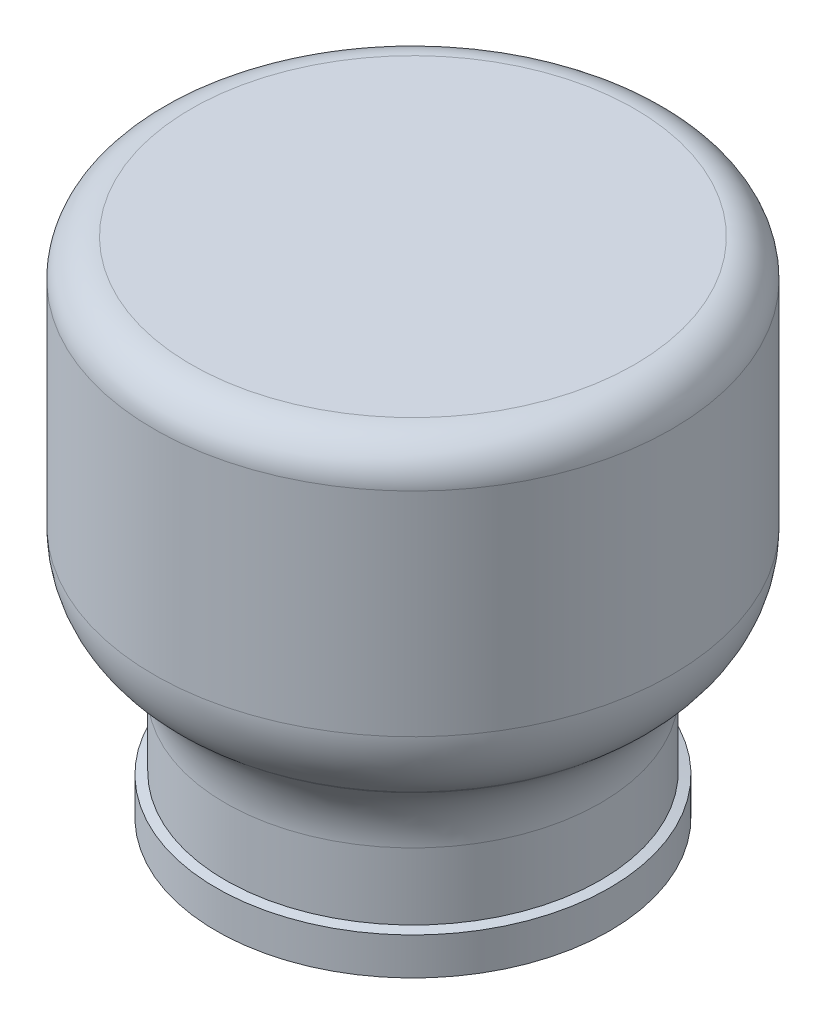
ISO-10303-21;
HEADER;
FILE_DESCRIPTION(('STEP AP214'),'2;1');
FILE_NAME('part.step','',(''),(''),'','','');
FILE_SCHEMA(('AUTOMOTIVE_DESIGN { 1 0 10303 214 1 1 1 1 }'));
ENDSEC;
DATA;
#1=APPLICATION_CONTEXT('core data for automotive mechanical design processes');
#2=APPLICATION_PROTOCOL_DEFINITION('international standard','automotive_design',2000,#1);
#3=PRODUCT_CONTEXT('',#1,'mechanical');
#4=PRODUCT('Part','Part','',(#3));
#5=PRODUCT_RELATED_PRODUCT_CATEGORY('part','',(#4));
#6=PRODUCT_DEFINITION_FORMATION('','',#4);
#7=PRODUCT_DEFINITION_CONTEXT('part definition',#1,'design');
#8=PRODUCT_DEFINITION('design','',#6,#7);
#9=PRODUCT_DEFINITION_SHAPE('','',#8);
#10=(LENGTH_UNIT() NAMED_UNIT(*) SI_UNIT(.MILLI.,.METRE.));
#11=(NAMED_UNIT(*) PLANE_ANGLE_UNIT() SI_UNIT($,.RADIAN.));
#12=(NAMED_UNIT(*) SI_UNIT($,.STERADIAN.) SOLID_ANGLE_UNIT());
#13=UNCERTAINTY_MEASURE_WITH_UNIT(LENGTH_MEASURE(1.E-05),#10,'distance_accuracy_value','');
#14=(GEOMETRIC_REPRESENTATION_CONTEXT(3) GLOBAL_UNCERTAINTY_ASSIGNED_CONTEXT((#13)) GLOBAL_UNIT_ASSIGNED_CONTEXT((#10,
#11,#12)) REPRESENTATION_CONTEXT('',''));
#15=CARTESIAN_POINT('',(0.,0.,0.));
#16=DIRECTION('',(0.,0.,1.));
#17=DIRECTION('',(1.,0.,0.));
#18=AXIS2_PLACEMENT_3D('',#15,#16,#17);
#19=CARTESIAN_POINT('',(1.14462986457853,39.,16.9000000000001));
#20=DIRECTION('',(0.,0.,1.));
#21=DIRECTION('',(1.,0.,0.));
#22=AXIS2_PLACEMENT_3D('',#19,#20,#21);
#23=CYLINDRICAL_SURFACE('',#22,10.);
#24=CARTESIAN_POINT('',(1.14462986457853,39.,16.9000000000001));
#25=DIRECTION('',(0.,0.,1.));
#26=DIRECTION('',(1.,0.,0.));
#27=AXIS2_PLACEMENT_3D('',#24,#25,#26);
#28=CIRCLE('',#27,10.);
#29=CARTESIAN_POINT('',(11.1446298645785,39.,16.9000000000001));
#30=VERTEX_POINT('',#29);
#31=EDGE_CURVE('E11',#30,#30,#28,.T.);
#32=ORIENTED_EDGE('',*,*,#31,.T.);
#33=EDGE_LOOP('',(#32));
#34=FACE_BOUND('',#33,.T.);
#35=CARTESIAN_POINT('',(1.14462986457853,39.,22.9000000000001));
#36=DIRECTION('',(0.,0.,1.));
#37=DIRECTION('',(1.,0.,0.));
#38=AXIS2_PLACEMENT_3D('',#35,#36,#37);
#39=CIRCLE('',#38,10.);
#40=CARTESIAN_POINT('',(11.1446298645785,39.,22.9000000000001));
#41=VERTEX_POINT('',#40);
#42=EDGE_CURVE('E46',#41,#41,#39,.T.);
#43=ORIENTED_EDGE('',*,*,#42,.F.);
#44=EDGE_LOOP('',(#43));
#45=FACE_BOUND('',#44,.T.);
#46=ADVANCED_FACE('F43',(#34,#45),#23,.T.);
#47=CARTESIAN_POINT('',(1.14462986457853,39.,16.9000000000001));
#48=DIRECTION('',(0.,0.,1.));
#49=DIRECTION('',(1.,0.,0.));
#50=AXIS2_PLACEMENT_3D('',#47,#48,#49);
#51=PLANE('',#50);
#52=ORIENTED_EDGE('',*,*,#31,.F.);
#53=EDGE_LOOP('',(#52));
#54=FACE_BOUND('',#53,.T.);
#55=ADVANCED_FACE('F58',(#54),#51,.F.);
#56=CARTESIAN_POINT('',(1.14462986457853,39.,22.9000000000001));
#57=DIRECTION('',(0.,0.,1.));
#58=DIRECTION('',(1.,0.,0.));
#59=AXIS2_PLACEMENT_3D('',#56,#57,#58);
#60=PLANE('',#59);
#61=ORIENTED_EDGE('',*,*,#42,.T.);
#62=EDGE_LOOP('',(#61));
#63=FACE_BOUND('',#62,.T.);
#64=ADVANCED_FACE('F55',(#63),#60,.T.);
#65=CLOSED_SHELL('',(#46,#55,#64));
#66=MANIFOLD_SOLID_BREP('B2',#65);
#67=CARTESIAN_POINT('',(19.9,15.,0.));
#68=DIRECTION('',(0.,-1.,0.));
#69=DIRECTION('',(1.,0.,0.));
#70=AXIS2_PLACEMENT_3D('',#67,#68,#69);
#71=PLANE('',#70);
#72=CARTESIAN_POINT('',(2.76491495539483,15.,0.));
#73=DIRECTION('',(0.,-1.,0.));
#74=DIRECTION('',(1.,0.,0.));
#75=AXIS2_PLACEMENT_3D('',#72,#73,#74);
#76=CIRCLE('',#75,17.1350850446052);
#77=CARTESIAN_POINT('',(19.9,15.,0.));
#78=VERTEX_POINT('',#77);
#79=EDGE_CURVE('E111',#78,#78,#76,.T.);
#80=ORIENTED_EDGE('',*,*,#79,.T.);
#81=EDGE_LOOP('',(#80));
#82=FACE_BOUND('',#81,.T.);
#83=ADVANCED_FACE('F87',(#82),#71,.T.);
#84=CARTESIAN_POINT('',(2.76491495539483,14.,0.));
#85=DIRECTION('',(0.,-1.,0.));
#86=DIRECTION('',(1.,0.,0.));
#87=AXIS2_PLACEMENT_3D('',#84,#85,#86);
#88=TOROIDAL_SURFACE('',#87,17.1350850446052,1.);
#89=CARTESIAN_POINT('',(2.76491495539483,14.,0.));
#90=DIRECTION('',(0.,-1.,0.));
#91=DIRECTION('',(1.,0.,0.));
#92=AXIS2_PLACEMENT_3D('',#89,#90,#91);
#93=CIRCLE('',#92,18.1350850446052);
#94=CARTESIAN_POINT('',(20.9,14.,0.));
#95=VERTEX_POINT('',#94);
#96=EDGE_CURVE('E114',#95,#95,#93,.T.);
#97=ORIENTED_EDGE('',*,*,#96,.T.);
#98=EDGE_LOOP('',(#97));
#99=FACE_BOUND('',#98,.T.);
#100=ORIENTED_EDGE('',*,*,#79,.F.);
#101=EDGE_LOOP('',(#100));
#102=FACE_BOUND('',#101,.T.);
#103=ADVANCED_FACE('F182',(#99,#102),#88,.F.);
#104=CARTESIAN_POINT('',(2.76491495539483,7.82182165652493,0.));
#105=DIRECTION('',(0.,-1.,0.));
#106=DIRECTION('',(1.,0.,0.));
#107=AXIS2_PLACEMENT_3D('',#104,#105,#106);
#108=CYLINDRICAL_SURFACE('',#107,18.1350850446052);
#109=CARTESIAN_POINT('',(2.76491495539483,0.,0.));
#110=DIRECTION('',(0.,-1.,0.));
#111=DIRECTION('',(1.,0.,0.));
#112=AXIS2_PLACEMENT_3D('',#109,#110,#111);
#113=CIRCLE('',#112,18.1350850446052);
#114=CARTESIAN_POINT('',(20.9,0.,0.));
#115=VERTEX_POINT('',#114);
#116=EDGE_CURVE('E117',#115,#115,#113,.T.);
#117=ORIENTED_EDGE('',*,*,#116,.T.);
#118=EDGE_LOOP('',(#117));
#119=FACE_BOUND('',#118,.T.);
#120=ORIENTED_EDGE('',*,*,#96,.F.);
#121=EDGE_LOOP('',(#120));
#122=FACE_BOUND('',#121,.T.);
#123=ADVANCED_FACE('F186',(#119,#122),#108,.F.);
#124=CARTESIAN_POINT('',(20.9,0.,0.));
#125=DIRECTION('',(0.,-1.,0.));
#126=DIRECTION('',(1.,0.,0.));
#127=AXIS2_PLACEMENT_3D('',#124,#125,#126);
#128=PLANE('',#127);
#129=CARTESIAN_POINT('',(2.76491495539483,0.,0.));
#130=DIRECTION('',(0.,-1.,0.));
#131=DIRECTION('',(1.,0.,0.));
#132=AXIS2_PLACEMENT_3D('',#129,#130,#131);
#133=CIRCLE('',#132,21.1066768821093);
#134=CARTESIAN_POINT('',(23.8715918375041,0.,0.));
#135=VERTEX_POINT('',#134);
#136=EDGE_CURVE('E120',#135,#135,#133,.T.);
#137=ORIENTED_EDGE('',*,*,#136,.T.);
#138=EDGE_LOOP('',(#137));
#139=FACE_BOUND('',#138,.T.);
#140=ORIENTED_EDGE('',*,*,#116,.F.);
#141=EDGE_LOOP('',(#140));
#142=FACE_BOUND('',#141,.T.);
#143=ADVANCED_FACE('F190',(#139,#142),#128,.T.);
#144=CARTESIAN_POINT('',(2.76491495539483,7.82182165652493,0.));
#145=DIRECTION('',(0.,-1.,0.));
#146=DIRECTION('',(1.,0.,0.));
#147=AXIS2_PLACEMENT_3D('',#144,#145,#146);
#148=CYLINDRICAL_SURFACE('',#147,21.1066768821093);
#149=CARTESIAN_POINT('',(2.76491495539483,4.,0.));
#150=DIRECTION('',(0.,-1.,0.));
#151=DIRECTION('',(1.,0.,0.));
#152=AXIS2_PLACEMENT_3D('',#149,#150,#151);
#153=CIRCLE('',#152,21.1066768821093);
#154=CARTESIAN_POINT('',(23.8715918375041,4.,0.));
#155=VERTEX_POINT('',#154);
#156=EDGE_CURVE('E123',#155,#155,#153,.T.);
#157=ORIENTED_EDGE('',*,*,#156,.T.);
#158=EDGE_LOOP('',(#157));
#159=FACE_BOUND('',#158,.T.);
#160=ORIENTED_EDGE('',*,*,#136,.F.);
#161=EDGE_LOOP('',(#160));
#162=FACE_BOUND('',#161,.T.);
#163=ADVANCED_FACE('F194',(#159,#162),#148,.T.);
#164=CARTESIAN_POINT('',(2.76491495539483,4.,0.));
#165=DIRECTION('',(0.,-1.,0.));
#166=DIRECTION('',(1.,0.,0.));
#167=AXIS2_PLACEMENT_3D('',#164,#165,#166);
#168=CONICAL_SURFACE('',#167,21.1066768821093,1.33186665186768);
#169=CARTESIAN_POINT('',(2.76491495539483,4.23666284308145,0.));
#170=DIRECTION('',(0.,-1.,0.));
#171=DIRECTION('',(1.,0.,0.));
#172=AXIS2_PLACEMENT_3D('',#169,#170,#171);
#173=CIRCLE('',#172,20.1350850446052);
#174=CARTESIAN_POINT('',(22.9,4.23666284308145,0.));
#175=VERTEX_POINT('',#174);
#176=EDGE_CURVE('E126',#175,#175,#173,.T.);
#177=ORIENTED_EDGE('',*,*,#176,.T.);
#178=EDGE_LOOP('',(#177));
#179=FACE_BOUND('',#178,.T.);
#180=ORIENTED_EDGE('',*,*,#156,.F.);
#181=EDGE_LOOP('',(#180));
#182=FACE_BOUND('',#181,.T.);
#183=ADVANCED_FACE('F198',(#179,#182),#168,.T.);
#184=CARTESIAN_POINT('',(2.76491495539483,7.82182165652493,0.));
#185=DIRECTION('',(0.,-1.,0.));
#186=DIRECTION('',(1.,0.,0.));
#187=AXIS2_PLACEMENT_3D('',#184,#185,#186);
#188=CYLINDRICAL_SURFACE('',#187,20.1350850446052);
#189=CARTESIAN_POINT('',(2.76491495539483,11.4043081021399,0.));
#190=DIRECTION('',(0.,-1.,0.));
#191=DIRECTION('',(1.,0.,0.));
#192=AXIS2_PLACEMENT_3D('',#189,#190,#191);
#193=CIRCLE('',#192,20.1350850446052);
#194=CARTESIAN_POINT('',(22.9,11.4043081021399,0.));
#195=VERTEX_POINT('',#194);
#196=EDGE_CURVE('E129',#195,#195,#193,.T.);
#197=ORIENTED_EDGE('',*,*,#196,.T.);
#198=EDGE_LOOP('',(#197));
#199=FACE_BOUND('',#198,.T.);
#200=ORIENTED_EDGE('',*,*,#176,.F.);
#201=EDGE_LOOP('',(#200));
#202=FACE_BOUND('',#201,.T.);
#203=ADVANCED_FACE('F202',(#199,#202),#188,.T.);
#204=CARTESIAN_POINT('',(2.76491495539483,11.40430810214,0.));
#205=DIRECTION('',(0.,-1.,0.));
#206=DIRECTION('',(1.,0.,0.));
#207=AXIS2_PLACEMENT_3D('',#204,#205,#206);
#208=TOROIDAL_SURFACE('',#207,30.1350850446052,10.);
#209=CARTESIAN_POINT('',(2.76491495539483,19.0647525333298,0.));
#210=DIRECTION('',(0.,-1.,0.));
#211=DIRECTION('',(1.,0.,0.));
#212=AXIS2_PLACEMENT_3D('',#209,#210,#211);
#213=CIRCLE('',#212,23.7072089477399);
#214=CARTESIAN_POINT('',(26.4721239031347,19.0647525333298,0.));
#215=VERTEX_POINT('',#214);
#216=EDGE_CURVE('E132',#215,#215,#213,.T.);
#217=ORIENTED_EDGE('',*,*,#216,.T.);
#218=EDGE_LOOP('',(#217));
#219=FACE_BOUND('',#218,.T.);
#220=ORIENTED_EDGE('',*,*,#196,.F.);
#221=EDGE_LOOP('',(#220));
#222=FACE_BOUND('',#221,.T.);
#223=ADVANCED_FACE('F206',(#219,#222),#208,.F.);
#224=CARTESIAN_POINT('',(2.76491495539483,19.0647525333298,0.));
#225=DIRECTION('',(0.,1.,0.));
#226=DIRECTION('',(-1.,0.,0.));
#227=AXIS2_PLACEMENT_3D('',#224,#225,#226);
#228=CONICAL_SURFACE('',#227,23.7072089477399,0.872664625997171);
#229=CARTESIAN_POINT('',(2.76491495539483,19.4978929309155,0.));
#230=DIRECTION('',(0.,-1.,0.));
#231=DIRECTION('',(1.,0.,0.));
#232=AXIS2_PLACEMENT_3D('',#229,#230,#231);
#233=CIRCLE('',#232,24.2234055726603);
#234=CARTESIAN_POINT('',(26.9883205280551,19.4978929309155,0.));
#235=VERTEX_POINT('',#234);
#236=EDGE_CURVE('E135',#235,#235,#233,.T.);
#237=ORIENTED_EDGE('',*,*,#236,.T.);
#238=EDGE_LOOP('',(#237));
#239=FACE_BOUND('',#238,.T.);
#240=ORIENTED_EDGE('',*,*,#216,.F.);
#241=EDGE_LOOP('',(#240));
#242=FACE_BOUND('',#241,.T.);
#243=ADVANCED_FACE('F210',(#239,#242),#228,.T.);
#244=CARTESIAN_POINT('',(2.76491495539483,27.1583373621054,0.));
#245=DIRECTION('',(0.,-1.,0.));
#246=DIRECTION('',(1.,0.,0.));
#247=AXIS2_PLACEMENT_3D('',#244,#245,#246);
#248=TOROIDAL_SURFACE('',#247,17.795529475795,10.);
#249=CARTESIAN_POINT('',(2.76491495539483,27.1583373621054,0.));
#250=DIRECTION('',(0.,-1.,0.));
#251=DIRECTION('',(1.,0.,0.));
#252=AXIS2_PLACEMENT_3D('',#249,#250,#251);
#253=CIRCLE('',#252,27.795529475795);
#254=CARTESIAN_POINT('',(30.5604444311898,27.1583373621054,0.));
#255=VERTEX_POINT('',#254);
#256=EDGE_CURVE('E138',#255,#255,#253,.T.);
#257=ORIENTED_EDGE('',*,*,#256,.T.);
#258=EDGE_LOOP('',(#257));
#259=FACE_BOUND('',#258,.T.);
#260=ORIENTED_EDGE('',*,*,#236,.F.);
#261=EDGE_LOOP('',(#260));
#262=FACE_BOUND('',#261,.T.);
#263=ADVANCED_FACE('F214',(#259,#262),#248,.T.);
#264=CARTESIAN_POINT('',(2.76491495539483,7.82182165652493,0.));
#265=DIRECTION('',(0.,-1.,0.));
#266=DIRECTION('',(1.,0.,0.));
#267=AXIS2_PLACEMENT_3D('',#264,#265,#266);
#268=CYLINDRICAL_SURFACE('',#267,27.795529475795);
#269=CARTESIAN_POINT('',(2.76491495539482,50.,0.));
#270=DIRECTION('',(0.,-1.,0.));
#271=DIRECTION('',(1.,0.,0.));
#272=AXIS2_PLACEMENT_3D('',#269,#270,#271);
#273=CIRCLE('',#272,27.795529475795);
#274=CARTESIAN_POINT('',(30.5604444311898,50.,0.));
#275=VERTEX_POINT('',#274);
#276=EDGE_CURVE('E141',#275,#275,#273,.T.);
#277=ORIENTED_EDGE('',*,*,#276,.T.);
#278=EDGE_LOOP('',(#277));
#279=FACE_BOUND('',#278,.T.);
#280=ORIENTED_EDGE('',*,*,#256,.F.);
#281=EDGE_LOOP('',(#280));
#282=FACE_BOUND('',#281,.T.);
#283=ADVANCED_FACE('F218',(#279,#282),#268,.T.);
#284=CARTESIAN_POINT('',(2.76491495539482,50.,0.));
#285=DIRECTION('',(0.,-1.,0.));
#286=DIRECTION('',(1.,0.,0.));
#287=AXIS2_PLACEMENT_3D('',#284,#285,#286);
#288=TOROIDAL_SURFACE('',#287,23.795529475795,4.);
#289=CARTESIAN_POINT('',(2.76491495539482,54.,0.));
#290=DIRECTION('',(0.,-1.,0.));
#291=DIRECTION('',(1.,0.,0.));
#292=AXIS2_PLACEMENT_3D('',#289,#290,#291);
#293=CIRCLE('',#292,23.795529475795);
#294=CARTESIAN_POINT('',(26.5604444311898,54.,0.));
#295=VERTEX_POINT('',#294);
#296=EDGE_CURVE('E144',#295,#295,#293,.T.);
#297=ORIENTED_EDGE('',*,*,#296,.T.);
#298=EDGE_LOOP('',(#297));
#299=FACE_BOUND('',#298,.T.);
#300=ORIENTED_EDGE('',*,*,#276,.F.);
#301=EDGE_LOOP('',(#300));
#302=FACE_BOUND('',#301,.T.);
#303=ADVANCED_FACE('F222',(#299,#302),#288,.T.);
#304=CARTESIAN_POINT('',(26.5604444311898,54.,0.));
#305=DIRECTION('',(0.,1.,0.));
#306=DIRECTION('',(-1.,0.,0.));
#307=AXIS2_PLACEMENT_3D('',#304,#305,#306);
#308=PLANE('',#307);
#309=ORIENTED_EDGE('',*,*,#296,.F.);
#310=EDGE_LOOP('',(#309));
#311=FACE_BOUND('',#310,.T.);
#312=ADVANCED_FACE('F226',(#311),#308,.T.);
#313=CLOSED_SHELL('',(#83,#103,#123,#143,#163,#183,#203,#223,#243,#263,#283,#303,#312));
#314=CARTESIAN_POINT('',(2.76491495539482,50.,0.));
#315=DIRECTION('',(0.,-1.,0.));
#316=DIRECTION('',(1.,0.,0.));
#317=AXIS2_PLACEMENT_3D('',#314,#315,#316);
#318=TOROIDAL_SURFACE('',#317,23.795529475795,2.);
#319=CARTESIAN_POINT('',(2.76491495539482,50.,0.));
#320=DIRECTION('',(0.,-1.,0.));
#321=DIRECTION('',(1.,0.,0.));
#322=AXIS2_PLACEMENT_3D('',#319,#320,#321);
#323=CIRCLE('',#322,25.795529475795);
#324=CARTESIAN_POINT('',(28.5604444311898,50.,0.));
#325=VERTEX_POINT('',#324);
#326=EDGE_CURVE('E42',#325,#325,#323,.T.);
#327=ORIENTED_EDGE('',*,*,#326,.T.);
#328=EDGE_LOOP('',(#327));
#329=FACE_BOUND('',#328,.T.);
#330=CARTESIAN_POINT('',(2.76491495539482,52.,0.));
#331=DIRECTION('',(0.,-1.,0.));
#332=DIRECTION('',(1.,0.,0.));
#333=AXIS2_PLACEMENT_3D('',#330,#331,#332);
#334=CIRCLE('',#333,23.795529475795);
#335=CARTESIAN_POINT('',(26.5604444311898,52.,0.));
#336=VERTEX_POINT('',#335);
#337=EDGE_CURVE('E147',#336,#336,#334,.T.);
#338=ORIENTED_EDGE('',*,*,#337,.F.);
#339=EDGE_LOOP('',(#338));
#340=FACE_BOUND('',#339,.T.);
#341=ADVANCED_FACE('F89',(#329,#340),#318,.F.);
#342=CARTESIAN_POINT('',(2.76491495539483,7.82182165652493,0.));
#343=DIRECTION('',(0.,-1.,0.));
#344=DIRECTION('',(1.,0.,0.));
#345=AXIS2_PLACEMENT_3D('',#342,#343,#344);
#346=CYLINDRICAL_SURFACE('',#345,25.795529475795);
#347=CARTESIAN_POINT('',(2.76491495539483,28.0909526784154,0.));
#348=DIRECTION('',(0.,-1.,0.));
#349=DIRECTION('',(1.,0.,0.));
#350=AXIS2_PLACEMENT_3D('',#347,#348,#349);
#351=CIRCLE('',#350,25.795529475795);
#352=CARTESIAN_POINT('',(28.5604444311898,28.0909526784154,0.));
#353=VERTEX_POINT('',#352);
#354=EDGE_CURVE('E95',#353,#353,#351,.T.);
#355=ORIENTED_EDGE('',*,*,#354,.T.);
#356=EDGE_LOOP('',(#355));
#357=FACE_BOUND('',#356,.T.);
#358=ORIENTED_EDGE('',*,*,#326,.F.);
#359=EDGE_LOOP('',(#358));
#360=FACE_BOUND('',#359,.T.);
#361=ADVANCED_FACE('F154',(#357,#360),#346,.F.);
#362=CARTESIAN_POINT('',(2.76491495539483,28.0909526784154,0.));
#363=DIRECTION('',(0.,-1.,0.));
#364=DIRECTION('',(1.,0.,0.));
#365=AXIS2_PLACEMENT_3D('',#362,#363,#364);
#366=TOROIDAL_SURFACE('',#365,15.795529475795,10.);
#367=CARTESIAN_POINT('',(2.76491495539483,20.4305082472255,0.));
#368=DIRECTION('',(0.,-1.,0.));
#369=DIRECTION('',(1.,0.,0.));
#370=AXIS2_PLACEMENT_3D('',#367,#368,#369);
#371=CIRCLE('',#370,22.2234055726603);
#372=CARTESIAN_POINT('',(24.9883205280551,20.4305082472255,0.));
#373=VERTEX_POINT('',#372);
#374=EDGE_CURVE('E99',#373,#373,#371,.T.);
#375=ORIENTED_EDGE('',*,*,#374,.T.);
#376=EDGE_LOOP('',(#375));
#377=FACE_BOUND('',#376,.T.);
#378=ORIENTED_EDGE('',*,*,#354,.F.);
#379=EDGE_LOOP('',(#378));
#380=FACE_BOUND('',#379,.T.);
#381=ADVANCED_FACE('F160',(#377,#380),#366,.F.);
#382=CARTESIAN_POINT('',(2.76491495539483,20.4305082472255,0.));
#383=DIRECTION('',(0.,1.,0.));
#384=DIRECTION('',(-1.,0.,0.));
#385=AXIS2_PLACEMENT_3D('',#382,#383,#384);
#386=CONICAL_SURFACE('',#385,22.2234055726603,0.872664625997171);
#387=CARTESIAN_POINT('',(2.76491495539483,19.3395555688102,0.));
#388=DIRECTION('',(0.,-1.,0.));
#389=DIRECTION('',(1.,0.,0.));
#390=AXIS2_PLACEMENT_3D('',#387,#388,#389);
#391=CIRCLE('',#390,20.9232587988086);
#392=CARTESIAN_POINT('',(23.6881737542034,19.3395555688102,0.));
#393=VERTEX_POINT('',#392);
#394=EDGE_CURVE('E103',#393,#393,#391,.T.);
#395=ORIENTED_EDGE('',*,*,#394,.T.);
#396=EDGE_LOOP('',(#395));
#397=FACE_BOUND('',#396,.T.);
#398=ORIENTED_EDGE('',*,*,#374,.F.);
#399=EDGE_LOOP('',(#398));
#400=FACE_BOUND('',#399,.T.);
#401=ADVANCED_FACE('F164',(#397,#400),#386,.F.);
#402=CARTESIAN_POINT('',(2.76491495539483,27.,0.));
#403=DIRECTION('',(0.,-1.,0.));
#404=DIRECTION('',(1.,0.,0.));
#405=AXIS2_PLACEMENT_3D('',#402,#403,#404);
#406=TOROIDAL_SURFACE('',#405,14.4953827019432,10.);
#407=CARTESIAN_POINT('',(2.76491495539483,17.,0.));
#408=DIRECTION('',(0.,-1.,0.));
#409=DIRECTION('',(1.,0.,0.));
#410=AXIS2_PLACEMENT_3D('',#407,#408,#409);
#411=CIRCLE('',#410,14.4953827019431);
#412=CARTESIAN_POINT('',(17.260297657338,17.,0.));
#413=VERTEX_POINT('',#412);
#414=EDGE_CURVE('E108',#413,#413,#411,.T.);
#415=ORIENTED_EDGE('',*,*,#414,.T.);
#416=EDGE_LOOP('',(#415));
#417=FACE_BOUND('',#416,.T.);
#418=ORIENTED_EDGE('',*,*,#394,.F.);
#419=EDGE_LOOP('',(#418));
#420=FACE_BOUND('',#419,.T.);
#421=ADVANCED_FACE('F171',(#417,#420),#406,.F.);
#422=CARTESIAN_POINT('',(17.260297657338,17.,0.));
#423=DIRECTION('',(0.,1.,0.));
#424=DIRECTION('',(-1.,0.,0.));
#425=AXIS2_PLACEMENT_3D('',#422,#423,#424);
#426=PLANE('',#425);
#427=ORIENTED_EDGE('',*,*,#414,.F.);
#428=EDGE_LOOP('',(#427));
#429=FACE_BOUND('',#428,.T.);
#430=ADVANCED_FACE('F175',(#429),#426,.T.);
#431=CARTESIAN_POINT('',(26.5604444311898,52.,0.));
#432=DIRECTION('',(0.,-1.,0.));
#433=DIRECTION('',(1.,0.,0.));
#434=AXIS2_PLACEMENT_3D('',#431,#432,#433);
#435=PLANE('',#434);
#436=ORIENTED_EDGE('',*,*,#337,.T.);
#437=EDGE_LOOP('',(#436));
#438=FACE_BOUND('',#437,.T.);
#439=ADVANCED_FACE('F151',(#438),#435,.T.);
#440=CLOSED_SHELL('',(#341,#361,#381,#401,#421,#430,#439));
#441=ORIENTED_CLOSED_SHELL('',*,#440,.T.);
#442=BREP_WITH_VOIDS('B6',#313,(#441));
#443=ADVANCED_BREP_SHAPE_REPRESENTATION('',(#18,#66,#442),#14);
#444=SHAPE_DEFINITION_REPRESENTATION(#9,#443);
ENDSEC;
END-ISO-10303-21;
